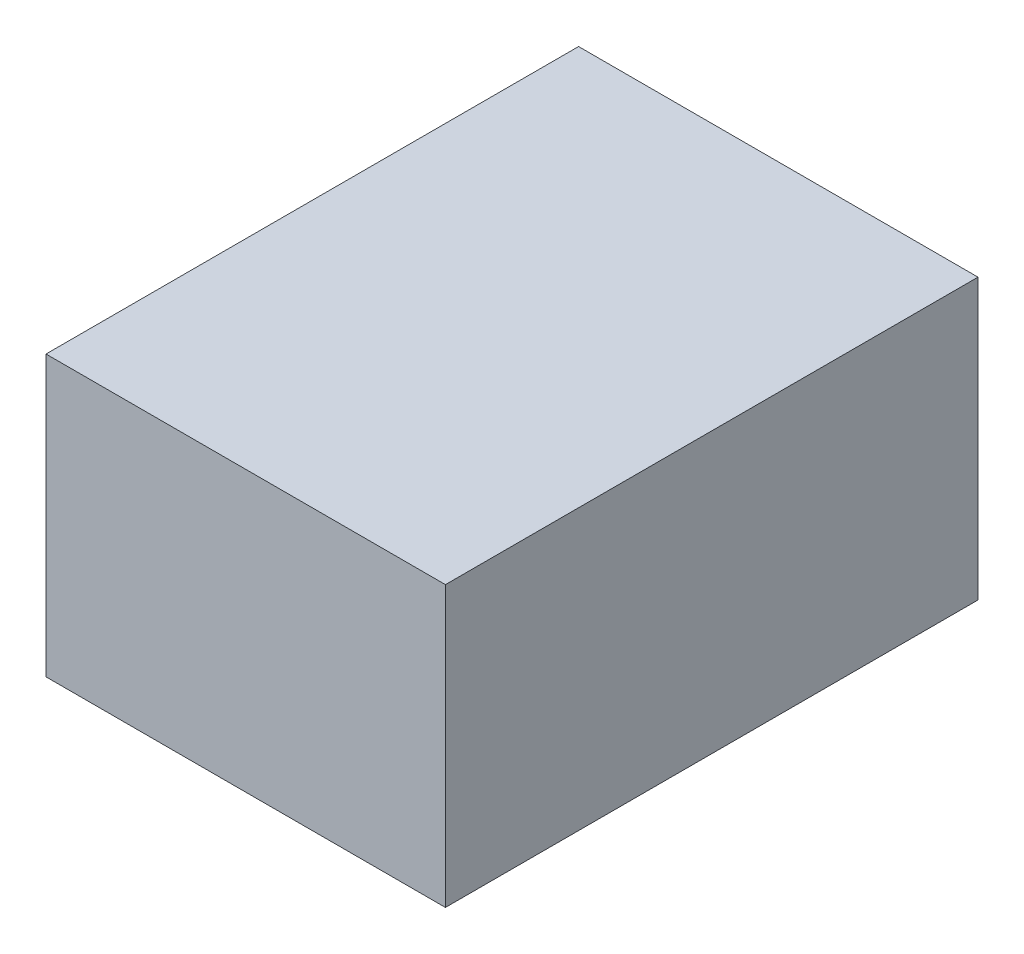
ISO-10303-21;
HEADER;
FILE_DESCRIPTION(('STEP AP214'),'2;1');
FILE_NAME('part.step','',(''),(''),'','','');
FILE_SCHEMA(('AUTOMOTIVE_DESIGN { 1 0 10303 214 1 1 1 1 }'));
ENDSEC;
DATA;
#1=APPLICATION_CONTEXT('core data for automotive mechanical design processes');
#2=APPLICATION_PROTOCOL_DEFINITION('international standard','automotive_design',2000,#1);
#3=PRODUCT_CONTEXT('',#1,'mechanical');
#4=PRODUCT('Part','Part','',(#3));
#5=PRODUCT_RELATED_PRODUCT_CATEGORY('part','',(#4));
#6=PRODUCT_DEFINITION_FORMATION('','',#4);
#7=PRODUCT_DEFINITION_CONTEXT('part definition',#1,'design');
#8=PRODUCT_DEFINITION('design','',#6,#7);
#9=PRODUCT_DEFINITION_SHAPE('','',#8);
#10=(LENGTH_UNIT() NAMED_UNIT(*) SI_UNIT(.MILLI.,.METRE.));
#11=(NAMED_UNIT(*) PLANE_ANGLE_UNIT() SI_UNIT($,.RADIAN.));
#12=(NAMED_UNIT(*) SI_UNIT($,.STERADIAN.) SOLID_ANGLE_UNIT());
#13=UNCERTAINTY_MEASURE_WITH_UNIT(LENGTH_MEASURE(1.E-05),#10,'distance_accuracy_value','');
#14=(GEOMETRIC_REPRESENTATION_CONTEXT(3) GLOBAL_UNCERTAINTY_ASSIGNED_CONTEXT((#13)) GLOBAL_UNIT_ASSIGNED_CONTEXT((#10,
#11,#12)) REPRESENTATION_CONTEXT('',''));
#15=CARTESIAN_POINT('',(0.,0.,0.));
#16=DIRECTION('',(0.,0.,1.));
#17=DIRECTION('',(1.,0.,0.));
#18=AXIS2_PLACEMENT_3D('',#15,#16,#17);
#19=CARTESIAN_POINT('',(-3.33538982239846,5.23523962256419,10.16));
#20=DIRECTION('',(1.,0.,0.));
#21=DIRECTION('',(0.,1.,0.));
#22=AXIS2_PLACEMENT_3D('',#19,#20,#21);
#23=PLANE('',#22);
#24=DIRECTION('',(0.,-1.,0.));
#25=VECTOR('',#24,1.);
#26=CARTESIAN_POINT('',(-3.33538982239846,5.23523962256419,0.));
#27=LINE('',#26,#25);
#28=CARTESIAN_POINT('',(-3.33538982239846,5.23523962256419,0.));
#29=VERTEX_POINT('',#28);
#30=CARTESIAN_POINT('',(-3.33538982239846,-0.0987603774358047,0.));
#31=VERTEX_POINT('',#30);
#32=EDGE_CURVE('E96',#29,#31,#27,.T.);
#33=ORIENTED_EDGE('',*,*,#32,.T.);
#34=DIRECTION('',(0.,0.,-1.));
#35=VECTOR('',#34,1.);
#36=CARTESIAN_POINT('',(-3.33538982239846,-0.0987603774358047,10.16));
#37=LINE('',#36,#35);
#38=CARTESIAN_POINT('',(-3.33538982239846,-0.0987603774358047,10.16));
#39=VERTEX_POINT('',#38);
#40=EDGE_CURVE('E11',#39,#31,#37,.T.);
#41=ORIENTED_EDGE('',*,*,#40,.F.);
#42=DIRECTION('',(0.,-1.,0.));
#43=VECTOR('',#42,1.);
#44=CARTESIAN_POINT('',(-3.33538982239846,5.23523962256419,10.16));
#45=LINE('',#44,#43);
#46=CARTESIAN_POINT('',(-3.33538982239846,5.23523962256419,10.16));
#47=VERTEX_POINT('',#46);
#48=EDGE_CURVE('E84',#47,#39,#45,.T.);
#49=ORIENTED_EDGE('',*,*,#48,.F.);
#50=DIRECTION('',(0.,0.,-1.));
#51=VECTOR('',#50,1.);
#52=CARTESIAN_POINT('',(-3.33538982239846,5.23523962256419,10.16));
#53=LINE('',#52,#51);
#54=EDGE_CURVE('E92',#47,#29,#53,.T.);
#55=ORIENTED_EDGE('',*,*,#54,.T.);
#56=EDGE_LOOP('',(#33,#41,#49,#55));
#57=FACE_BOUND('',#56,.T.);
#58=ADVANCED_FACE('F33',(#57),#23,.F.);
#59=CARTESIAN_POINT('',(-3.33538982239846,-0.0987603774358047,10.16));
#60=DIRECTION('',(0.,1.,0.));
#61=DIRECTION('',(0.,0.,1.));
#62=AXIS2_PLACEMENT_3D('',#59,#60,#61);
#63=PLANE('',#62);
#64=DIRECTION('',(1.,0.,0.));
#65=VECTOR('',#64,1.);
#66=CARTESIAN_POINT('',(-3.33538982239846,-0.0987603774358047,0.));
#67=LINE('',#66,#65);
#68=CARTESIAN_POINT('',(4.28461017760154,-0.0987603774358047,0.));
#69=VERTEX_POINT('',#68);
#70=EDGE_CURVE('E88',#31,#69,#67,.T.);
#71=ORIENTED_EDGE('',*,*,#70,.T.);
#72=DIRECTION('',(0.,0.,-1.));
#73=VECTOR('',#72,1.);
#74=CARTESIAN_POINT('',(4.28461017760154,-0.0987603774358047,10.16));
#75=LINE('',#74,#73);
#76=CARTESIAN_POINT('',(4.28461017760154,-0.0987603774358047,10.16));
#77=VERTEX_POINT('',#76);
#78=EDGE_CURVE('E41',#77,#69,#75,.T.);
#79=ORIENTED_EDGE('',*,*,#78,.F.);
#80=DIRECTION('',(1.,0.,0.));
#81=VECTOR('',#80,1.);
#82=CARTESIAN_POINT('',(-3.33538982239846,-0.0987603774358047,10.16));
#83=LINE('',#82,#81);
#84=EDGE_CURVE('E79',#39,#77,#83,.T.);
#85=ORIENTED_EDGE('',*,*,#84,.F.);
#86=ORIENTED_EDGE('',*,*,#40,.T.);
#87=EDGE_LOOP('',(#71,#79,#85,#86));
#88=FACE_BOUND('',#87,.T.);
#89=ADVANCED_FACE('F87',(#88),#63,.F.);
#90=CARTESIAN_POINT('',(4.28461017760154,5.23523962256419,10.16));
#91=DIRECTION('',(-1.,0.,0.));
#92=DIRECTION('',(0.,0.,1.));
#93=AXIS2_PLACEMENT_3D('',#90,#91,#92);
#94=PLANE('',#93);
#95=DIRECTION('',(0.,1.,0.));
#96=VECTOR('',#95,1.);
#97=CARTESIAN_POINT('',(4.28461017760154,5.23523962256419,0.));
#98=LINE('',#97,#96);
#99=CARTESIAN_POINT('',(4.28461017760154,5.23523962256419,0.));
#100=VERTEX_POINT('',#99);
#101=EDGE_CURVE('E66',#69,#100,#98,.T.);
#102=ORIENTED_EDGE('',*,*,#101,.T.);
#103=DIRECTION('',(0.,0.,-1.));
#104=VECTOR('',#103,1.);
#105=CARTESIAN_POINT('',(4.28461017760154,5.23523962256419,10.16));
#106=LINE('',#105,#104);
#107=CARTESIAN_POINT('',(4.28461017760154,5.23523962256419,10.16));
#108=VERTEX_POINT('',#107);
#109=EDGE_CURVE('E89',#108,#100,#106,.T.);
#110=ORIENTED_EDGE('',*,*,#109,.F.);
#111=DIRECTION('',(0.,1.,0.));
#112=VECTOR('',#111,1.);
#113=CARTESIAN_POINT('',(4.28461017760154,5.23523962256419,10.16));
#114=LINE('',#113,#112);
#115=EDGE_CURVE('E82',#77,#108,#114,.T.);
#116=ORIENTED_EDGE('',*,*,#115,.F.);
#117=ORIENTED_EDGE('',*,*,#78,.T.);
#118=EDGE_LOOP('',(#102,#110,#116,#117));
#119=FACE_BOUND('',#118,.T.);
#120=ADVANCED_FACE('F90',(#119),#94,.F.);
#121=CARTESIAN_POINT('',(-3.33538982239846,5.23523962256419,10.16));
#122=DIRECTION('',(0.,-1.,0.));
#123=DIRECTION('',(0.,0.,-1.));
#124=AXIS2_PLACEMENT_3D('',#121,#122,#123);
#125=PLANE('',#124);
#126=DIRECTION('',(-1.,0.,0.));
#127=VECTOR('',#126,1.);
#128=CARTESIAN_POINT('',(-3.33538982239846,5.23523962256419,0.));
#129=LINE('',#128,#127);
#130=EDGE_CURVE('E72',#100,#29,#129,.T.);
#131=ORIENTED_EDGE('',*,*,#130,.T.);
#132=ORIENTED_EDGE('',*,*,#54,.F.);
#133=DIRECTION('',(-1.,0.,0.));
#134=VECTOR('',#133,1.);
#135=CARTESIAN_POINT('',(-3.33538982239846,5.23523962256419,10.16));
#136=LINE('',#135,#134);
#137=EDGE_CURVE('E49',#108,#47,#136,.T.);
#138=ORIENTED_EDGE('',*,*,#137,.F.);
#139=ORIENTED_EDGE('',*,*,#109,.T.);
#140=EDGE_LOOP('',(#131,#132,#138,#139));
#141=FACE_BOUND('',#140,.T.);
#142=ADVANCED_FACE('F103',(#141),#125,.F.);
#143=CARTESIAN_POINT('',(0.,0.,10.16));
#144=DIRECTION('',(0.,0.,1.));
#145=DIRECTION('',(1.,0.,0.));
#146=AXIS2_PLACEMENT_3D('',#143,#144,#145);
#147=PLANE('',#146);
#148=ORIENTED_EDGE('',*,*,#48,.T.);
#149=ORIENTED_EDGE('',*,*,#84,.T.);
#150=ORIENTED_EDGE('',*,*,#115,.T.);
#151=ORIENTED_EDGE('',*,*,#137,.T.);
#152=EDGE_LOOP('',(#148,#149,#150,#151));
#153=FACE_BOUND('',#152,.T.);
#154=ADVANCED_FACE('F80',(#153),#147,.T.);
#155=CARTESIAN_POINT('',(0.,0.,0.));
#156=DIRECTION('',(0.,0.,1.));
#157=DIRECTION('',(1.,0.,0.));
#158=AXIS2_PLACEMENT_3D('',#155,#156,#157);
#159=PLANE('',#158);
#160=ORIENTED_EDGE('',*,*,#32,.F.);
#161=ORIENTED_EDGE('',*,*,#130,.F.);
#162=ORIENTED_EDGE('',*,*,#101,.F.);
#163=ORIENTED_EDGE('',*,*,#70,.F.);
#164=EDGE_LOOP('',(#160,#161,#162,#163));
#165=FACE_BOUND('',#164,.T.);
#166=ADVANCED_FACE('F106',(#165),#159,.F.);
#167=CLOSED_SHELL('',(#58,#89,#120,#142,#154,#166));
#168=MANIFOLD_SOLID_BREP('B2',#167);
#169=ADVANCED_BREP_SHAPE_REPRESENTATION('',(#18,#168),#14);
#170=SHAPE_DEFINITION_REPRESENTATION(#9,#169);
ENDSEC;
END-ISO-10303-21;
